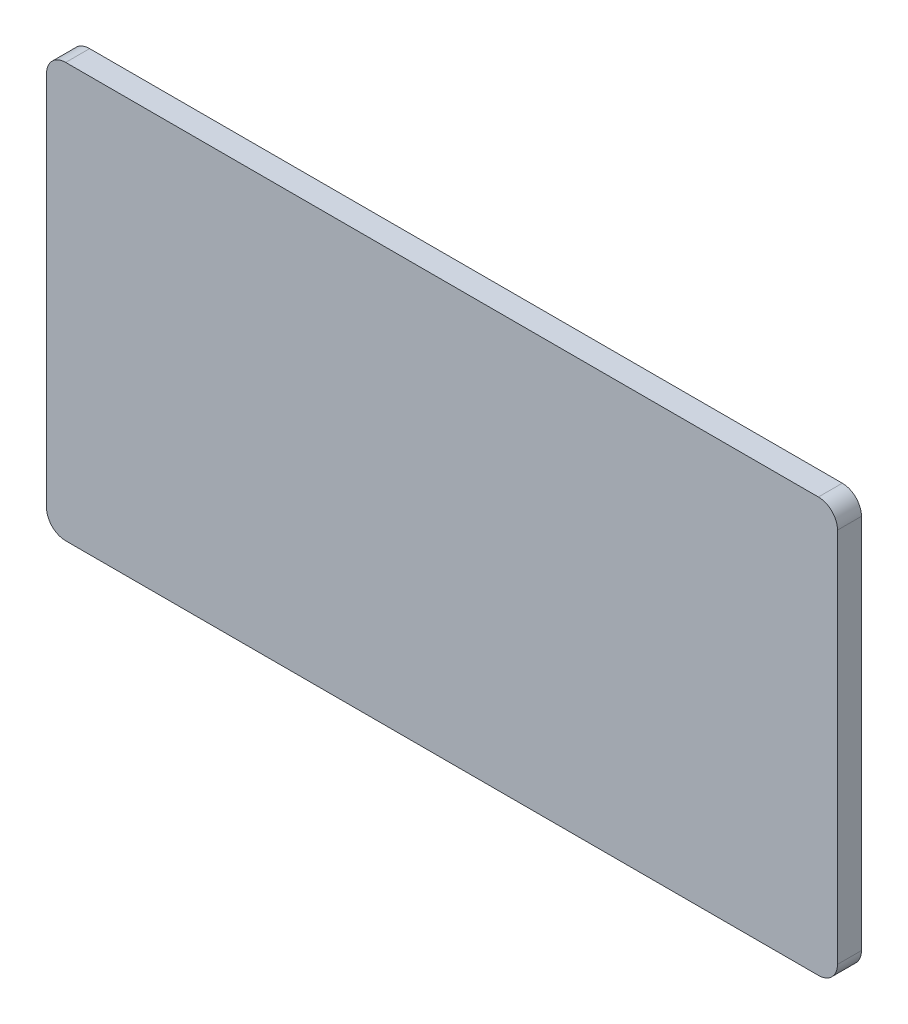
ISO-10303-21;
HEADER;
FILE_DESCRIPTION(('STEP AP214'),'2;1');
FILE_NAME('part.step','',(''),(''),'','','');
FILE_SCHEMA(('AUTOMOTIVE_DESIGN { 1 0 10303 214 1 1 1 1 }'));
ENDSEC;
DATA;
#1=APPLICATION_CONTEXT('core data for automotive mechanical design processes');
#2=APPLICATION_PROTOCOL_DEFINITION('international standard','automotive_design',2000,#1);
#3=PRODUCT_CONTEXT('',#1,'mechanical');
#4=PRODUCT('Part','Part','',(#3));
#5=PRODUCT_RELATED_PRODUCT_CATEGORY('part','',(#4));
#6=PRODUCT_DEFINITION_FORMATION('','',#4);
#7=PRODUCT_DEFINITION_CONTEXT('part definition',#1,'design');
#8=PRODUCT_DEFINITION('design','',#6,#7);
#9=PRODUCT_DEFINITION_SHAPE('','',#8);
#10=(LENGTH_UNIT() NAMED_UNIT(*) SI_UNIT(.MILLI.,.METRE.));
#11=(NAMED_UNIT(*) PLANE_ANGLE_UNIT() SI_UNIT($,.RADIAN.));
#12=(NAMED_UNIT(*) SI_UNIT($,.STERADIAN.) SOLID_ANGLE_UNIT());
#13=UNCERTAINTY_MEASURE_WITH_UNIT(LENGTH_MEASURE(1.E-05),#10,'distance_accuracy_value','');
#14=(GEOMETRIC_REPRESENTATION_CONTEXT(3) GLOBAL_UNCERTAINTY_ASSIGNED_CONTEXT((#13)) GLOBAL_UNIT_ASSIGNED_CONTEXT((#10,
#11,#12)) REPRESENTATION_CONTEXT('',''));
#15=CARTESIAN_POINT('',(0.,0.,0.));
#16=DIRECTION('',(0.,0.,1.));
#17=DIRECTION('',(1.,0.,0.));
#18=AXIS2_PLACEMENT_3D('',#15,#16,#17);
#19=CARTESIAN_POINT('',(52.5,-27.5,3.175));
#20=DIRECTION('',(-1.,0.,0.));
#21=DIRECTION('',(0.,0.,1.));
#22=AXIS2_PLACEMENT_3D('',#19,#20,#21);
#23=PLANE('',#22);
#24=DIRECTION('',(0.,1.,0.));
#25=VECTOR('',#24,1.);
#26=CARTESIAN_POINT('',(52.5,-27.5,3.175));
#27=LINE('',#26,#25);
#28=CARTESIAN_POINT('',(52.5,-24.96,3.175));
#29=VERTEX_POINT('',#28);
#30=CARTESIAN_POINT('',(52.5,24.96,3.175));
#31=VERTEX_POINT('',#30);
#32=EDGE_CURVE('E135',#29,#31,#27,.T.);
#33=ORIENTED_EDGE('',*,*,#32,.F.);
#34=DIRECTION('',(0.,0.,-1.));
#35=VECTOR('',#34,1.);
#36=CARTESIAN_POINT('',(52.5,-24.96,3.175));
#37=LINE('',#36,#35);
#38=CARTESIAN_POINT('',(52.5,-24.96,0.));
#39=VERTEX_POINT('',#38);
#40=EDGE_CURVE('E11',#29,#39,#37,.T.);
#41=ORIENTED_EDGE('',*,*,#40,.T.);
#42=DIRECTION('',(0.,1.,0.));
#43=VECTOR('',#42,1.);
#44=CARTESIAN_POINT('',(52.5,-27.5,0.));
#45=LINE('',#44,#43);
#46=CARTESIAN_POINT('',(52.5,24.96,0.));
#47=VERTEX_POINT('',#46);
#48=EDGE_CURVE('E166',#39,#47,#45,.T.);
#49=ORIENTED_EDGE('',*,*,#48,.T.);
#50=DIRECTION('',(0.,0.,-1.));
#51=VECTOR('',#50,1.);
#52=CARTESIAN_POINT('',(52.5,24.96,3.175));
#53=LINE('',#52,#51);
#54=EDGE_CURVE('E49',#47,#31,#53,.F.);
#55=ORIENTED_EDGE('',*,*,#54,.T.);
#56=EDGE_LOOP('',(#33,#41,#49,#55));
#57=FACE_BOUND('',#56,.T.);
#58=ADVANCED_FACE('F41',(#57),#23,.F.);
#59=CARTESIAN_POINT('',(-52.5,27.5,3.175));
#60=DIRECTION('',(0.,-1.,0.));
#61=DIRECTION('',(0.,0.,-1.));
#62=AXIS2_PLACEMENT_3D('',#59,#60,#61);
#63=PLANE('',#62);
#64=DIRECTION('',(-1.,0.,0.));
#65=VECTOR('',#64,1.);
#66=CARTESIAN_POINT('',(-52.5,27.5,0.));
#67=LINE('',#66,#65);
#68=CARTESIAN_POINT('',(49.96,27.5,0.));
#69=VERTEX_POINT('',#68);
#70=CARTESIAN_POINT('',(-49.96,27.5,0.));
#71=VERTEX_POINT('',#70);
#72=EDGE_CURVE('E140',#69,#71,#67,.T.);
#73=ORIENTED_EDGE('',*,*,#72,.T.);
#74=DIRECTION('',(0.,0.,-1.));
#75=VECTOR('',#74,1.);
#76=CARTESIAN_POINT('',(-49.96,27.5,3.175));
#77=LINE('',#76,#75);
#78=CARTESIAN_POINT('',(-49.96,27.5,3.175));
#79=VERTEX_POINT('',#78);
#80=EDGE_CURVE('E56',#71,#79,#77,.F.);
#81=ORIENTED_EDGE('',*,*,#80,.T.);
#82=DIRECTION('',(-1.,0.,0.));
#83=VECTOR('',#82,1.);
#84=CARTESIAN_POINT('',(-52.5,27.5,3.175));
#85=LINE('',#84,#83);
#86=CARTESIAN_POINT('',(49.96,27.5,3.175));
#87=VERTEX_POINT('',#86);
#88=EDGE_CURVE('E138',#87,#79,#85,.T.);
#89=ORIENTED_EDGE('',*,*,#88,.F.);
#90=DIRECTION('',(0.,0.,-1.));
#91=VECTOR('',#90,1.);
#92=CARTESIAN_POINT('',(49.96,27.5,3.175));
#93=LINE('',#92,#91);
#94=EDGE_CURVE('E158',#87,#69,#93,.T.);
#95=ORIENTED_EDGE('',*,*,#94,.T.);
#96=EDGE_LOOP('',(#73,#81,#89,#95));
#97=FACE_BOUND('',#96,.T.);
#98=ADVANCED_FACE('F173',(#97),#63,.F.);
#99=CARTESIAN_POINT('',(-52.5,-27.5,3.175));
#100=DIRECTION('',(1.,0.,0.));
#101=DIRECTION('',(0.,0.,-1.));
#102=AXIS2_PLACEMENT_3D('',#99,#100,#101);
#103=PLANE('',#102);
#104=DIRECTION('',(0.,-1.,0.));
#105=VECTOR('',#104,1.);
#106=CARTESIAN_POINT('',(-52.5,-27.5,0.));
#107=LINE('',#106,#105);
#108=CARTESIAN_POINT('',(-52.5,24.96,0.));
#109=VERTEX_POINT('',#108);
#110=CARTESIAN_POINT('',(-52.5,-24.96,0.));
#111=VERTEX_POINT('',#110);
#112=EDGE_CURVE('E136',#109,#111,#107,.T.);
#113=ORIENTED_EDGE('',*,*,#112,.T.);
#114=DIRECTION('',(0.,0.,-1.));
#115=VECTOR('',#114,1.);
#116=CARTESIAN_POINT('',(-52.5,-24.96,3.175));
#117=LINE('',#116,#115);
#118=CARTESIAN_POINT('',(-52.5,-24.96,3.175));
#119=VERTEX_POINT('',#118);
#120=EDGE_CURVE('E113',#111,#119,#117,.F.);
#121=ORIENTED_EDGE('',*,*,#120,.T.);
#122=DIRECTION('',(0.,-1.,0.));
#123=VECTOR('',#122,1.);
#124=CARTESIAN_POINT('',(-52.5,-27.5,3.175));
#125=LINE('',#124,#123);
#126=CARTESIAN_POINT('',(-52.5,24.96,3.175));
#127=VERTEX_POINT('',#126);
#128=EDGE_CURVE('E177',#127,#119,#125,.T.);
#129=ORIENTED_EDGE('',*,*,#128,.F.);
#130=DIRECTION('',(0.,0.,-1.));
#131=VECTOR('',#130,1.);
#132=CARTESIAN_POINT('',(-52.5,24.96,3.175));
#133=LINE('',#132,#131);
#134=EDGE_CURVE('E118',#127,#109,#133,.T.);
#135=ORIENTED_EDGE('',*,*,#134,.T.);
#136=EDGE_LOOP('',(#113,#121,#129,#135));
#137=FACE_BOUND('',#136,.T.);
#138=ADVANCED_FACE('F185',(#137),#103,.F.);
#139=CARTESIAN_POINT('',(-52.5,-27.5,3.175));
#140=DIRECTION('',(0.,1.,0.));
#141=DIRECTION('',(0.,0.,1.));
#142=AXIS2_PLACEMENT_3D('',#139,#140,#141);
#143=PLANE('',#142);
#144=DIRECTION('',(1.,0.,0.));
#145=VECTOR('',#144,1.);
#146=CARTESIAN_POINT('',(-52.5,-27.5,3.175));
#147=LINE('',#146,#145);
#148=CARTESIAN_POINT('',(-49.96,-27.5,3.175));
#149=VERTEX_POINT('',#148);
#150=CARTESIAN_POINT('',(49.96,-27.5,3.175));
#151=VERTEX_POINT('',#150);
#152=EDGE_CURVE('E128',#149,#151,#147,.T.);
#153=ORIENTED_EDGE('',*,*,#152,.F.);
#154=DIRECTION('',(0.,0.,-1.));
#155=VECTOR('',#154,1.);
#156=CARTESIAN_POINT('',(-49.96,-27.5,3.175));
#157=LINE('',#156,#155);
#158=CARTESIAN_POINT('',(-49.96,-27.5,0.));
#159=VERTEX_POINT('',#158);
#160=EDGE_CURVE('E112',#149,#159,#157,.T.);
#161=ORIENTED_EDGE('',*,*,#160,.T.);
#162=DIRECTION('',(1.,0.,0.));
#163=VECTOR('',#162,1.);
#164=CARTESIAN_POINT('',(-52.5,-27.5,0.));
#165=LINE('',#164,#163);
#166=CARTESIAN_POINT('',(49.96,-27.5,0.));
#167=VERTEX_POINT('',#166);
#168=EDGE_CURVE('E125',#159,#167,#165,.T.);
#169=ORIENTED_EDGE('',*,*,#168,.T.);
#170=DIRECTION('',(0.,0.,-1.));
#171=VECTOR('',#170,1.);
#172=CARTESIAN_POINT('',(49.96,-27.5,3.175));
#173=LINE('',#172,#171);
#174=EDGE_CURVE('E130',#167,#151,#173,.F.);
#175=ORIENTED_EDGE('',*,*,#174,.T.);
#176=EDGE_LOOP('',(#153,#161,#169,#175));
#177=FACE_BOUND('',#176,.T.);
#178=ADVANCED_FACE('F124',(#177),#143,.F.);
#179=CARTESIAN_POINT('',(0.,0.,3.175));
#180=DIRECTION('',(0.,0.,-1.));
#181=DIRECTION('',(-1.,0.,0.));
#182=AXIS2_PLACEMENT_3D('',#179,#180,#181);
#183=PLANE('',#182);
#184=ORIENTED_EDGE('',*,*,#128,.T.);
#185=CARTESIAN_POINT('',(-49.96,-24.96,3.175));
#186=DIRECTION('',(0.,0.,-1.));
#187=DIRECTION('',(-1.,0.,0.));
#188=AXIS2_PLACEMENT_3D('',#185,#186,#187);
#189=CIRCLE('',#188,2.54);
#190=EDGE_CURVE('E156',#119,#149,#189,.F.);
#191=ORIENTED_EDGE('',*,*,#190,.T.);
#192=ORIENTED_EDGE('',*,*,#152,.T.);
#193=CARTESIAN_POINT('',(49.96,-24.96,3.175));
#194=DIRECTION('',(0.,0.,-1.));
#195=DIRECTION('',(-1.,0.,0.));
#196=AXIS2_PLACEMENT_3D('',#193,#194,#195);
#197=CIRCLE('',#196,2.54);
#198=EDGE_CURVE('E152',#151,#29,#197,.F.);
#199=ORIENTED_EDGE('',*,*,#198,.T.);
#200=ORIENTED_EDGE('',*,*,#32,.T.);
#201=CARTESIAN_POINT('',(49.96,24.96,3.175));
#202=DIRECTION('',(0.,0.,-1.));
#203=DIRECTION('',(-1.,0.,0.));
#204=AXIS2_PLACEMENT_3D('',#201,#202,#203);
#205=CIRCLE('',#204,2.54);
#206=EDGE_CURVE('E63',#31,#87,#205,.F.);
#207=ORIENTED_EDGE('',*,*,#206,.T.);
#208=ORIENTED_EDGE('',*,*,#88,.T.);
#209=CARTESIAN_POINT('',(-49.96,24.96,3.175));
#210=DIRECTION('',(0.,0.,-1.));
#211=DIRECTION('',(-1.,0.,0.));
#212=AXIS2_PLACEMENT_3D('',#209,#210,#211);
#213=CIRCLE('',#212,2.54);
#214=EDGE_CURVE('E154',#79,#127,#213,.F.);
#215=ORIENTED_EDGE('',*,*,#214,.T.);
#216=EDGE_LOOP('',(#184,#191,#192,#199,#200,#207,#208,#215));
#217=FACE_BOUND('',#216,.T.);
#218=ADVANCED_FACE('F169',(#217),#183,.F.);
#219=CARTESIAN_POINT('',(0.,0.,0.));
#220=DIRECTION('',(0.,0.,-1.));
#221=DIRECTION('',(-1.,0.,0.));
#222=AXIS2_PLACEMENT_3D('',#219,#220,#221);
#223=PLANE('',#222);
#224=ORIENTED_EDGE('',*,*,#168,.F.);
#225=CARTESIAN_POINT('',(-49.96,-24.96,0.));
#226=DIRECTION('',(0.,0.,-1.));
#227=DIRECTION('',(-1.,0.,0.));
#228=AXIS2_PLACEMENT_3D('',#225,#226,#227);
#229=CIRCLE('',#228,2.54);
#230=EDGE_CURVE('E108',#159,#111,#229,.T.);
#231=ORIENTED_EDGE('',*,*,#230,.T.);
#232=ORIENTED_EDGE('',*,*,#112,.F.);
#233=CARTESIAN_POINT('',(-49.96,24.96,0.));
#234=DIRECTION('',(0.,0.,-1.));
#235=DIRECTION('',(-1.,0.,0.));
#236=AXIS2_PLACEMENT_3D('',#233,#234,#235);
#237=CIRCLE('',#236,2.54);
#238=EDGE_CURVE('E119',#109,#71,#237,.T.);
#239=ORIENTED_EDGE('',*,*,#238,.T.);
#240=ORIENTED_EDGE('',*,*,#72,.F.);
#241=CARTESIAN_POINT('',(49.96,24.96,0.));
#242=DIRECTION('',(0.,0.,-1.));
#243=DIRECTION('',(-1.,0.,0.));
#244=AXIS2_PLACEMENT_3D('',#241,#242,#243);
#245=CIRCLE('',#244,2.54);
#246=EDGE_CURVE('E129',#69,#47,#245,.T.);
#247=ORIENTED_EDGE('',*,*,#246,.T.);
#248=ORIENTED_EDGE('',*,*,#48,.F.);
#249=CARTESIAN_POINT('',(49.96,-24.96,0.));
#250=DIRECTION('',(0.,0.,-1.));
#251=DIRECTION('',(-1.,0.,0.));
#252=AXIS2_PLACEMENT_3D('',#249,#250,#251);
#253=CIRCLE('',#252,2.54);
#254=EDGE_CURVE('E134',#39,#167,#253,.T.);
#255=ORIENTED_EDGE('',*,*,#254,.T.);
#256=EDGE_LOOP('',(#224,#231,#232,#239,#240,#247,#248,#255));
#257=FACE_BOUND('',#256,.T.);
#258=ADVANCED_FACE('F132',(#257),#223,.T.);
#259=CARTESIAN_POINT('',(-49.96,-24.96,3.175));
#260=DIRECTION('',(0.,0.,-1.));
#261=DIRECTION('',(-1.,0.,0.));
#262=AXIS2_PLACEMENT_3D('',#259,#260,#261);
#263=CYLINDRICAL_SURFACE('',#262,2.54);
#264=ORIENTED_EDGE('',*,*,#190,.F.);
#265=ORIENTED_EDGE('',*,*,#120,.F.);
#266=ORIENTED_EDGE('',*,*,#230,.F.);
#267=ORIENTED_EDGE('',*,*,#160,.F.);
#268=EDGE_LOOP('',(#264,#265,#266,#267));
#269=FACE_BOUND('',#268,.T.);
#270=ADVANCED_FACE('F111',(#269),#263,.T.);
#271=CARTESIAN_POINT('',(-49.96,24.96,3.175));
#272=DIRECTION('',(0.,0.,-1.));
#273=DIRECTION('',(-1.,0.,0.));
#274=AXIS2_PLACEMENT_3D('',#271,#272,#273);
#275=CYLINDRICAL_SURFACE('',#274,2.54);
#276=ORIENTED_EDGE('',*,*,#214,.F.);
#277=ORIENTED_EDGE('',*,*,#80,.F.);
#278=ORIENTED_EDGE('',*,*,#238,.F.);
#279=ORIENTED_EDGE('',*,*,#134,.F.);
#280=EDGE_LOOP('',(#276,#277,#278,#279));
#281=FACE_BOUND('',#280,.T.);
#282=ADVANCED_FACE('F183',(#281),#275,.T.);
#283=CARTESIAN_POINT('',(49.96,-24.96,3.175));
#284=DIRECTION('',(0.,0.,-1.));
#285=DIRECTION('',(-1.,0.,0.));
#286=AXIS2_PLACEMENT_3D('',#283,#284,#285);
#287=CYLINDRICAL_SURFACE('',#286,2.54);
#288=ORIENTED_EDGE('',*,*,#198,.F.);
#289=ORIENTED_EDGE('',*,*,#174,.F.);
#290=ORIENTED_EDGE('',*,*,#254,.F.);
#291=ORIENTED_EDGE('',*,*,#40,.F.);
#292=EDGE_LOOP('',(#288,#289,#290,#291));
#293=FACE_BOUND('',#292,.T.);
#294=ADVANCED_FACE('F187',(#293),#287,.T.);
#295=CARTESIAN_POINT('',(49.96,24.96,3.175));
#296=DIRECTION('',(0.,0.,-1.));
#297=DIRECTION('',(-1.,0.,0.));
#298=AXIS2_PLACEMENT_3D('',#295,#296,#297);
#299=CYLINDRICAL_SURFACE('',#298,2.54);
#300=ORIENTED_EDGE('',*,*,#206,.F.);
#301=ORIENTED_EDGE('',*,*,#54,.F.);
#302=ORIENTED_EDGE('',*,*,#246,.F.);
#303=ORIENTED_EDGE('',*,*,#94,.F.);
#304=EDGE_LOOP('',(#300,#301,#302,#303));
#305=FACE_BOUND('',#304,.T.);
#306=ADVANCED_FACE('F43',(#305),#299,.T.);
#307=CLOSED_SHELL('',(#58,#98,#138,#178,#218,#258,#270,#282,#294,#306));
#308=MANIFOLD_SOLID_BREP('B2',#307);
#309=ADVANCED_BREP_SHAPE_REPRESENTATION('',(#18,#308),#14);
#310=SHAPE_DEFINITION_REPRESENTATION(#9,#309);
ENDSEC;
END-ISO-10303-21;
